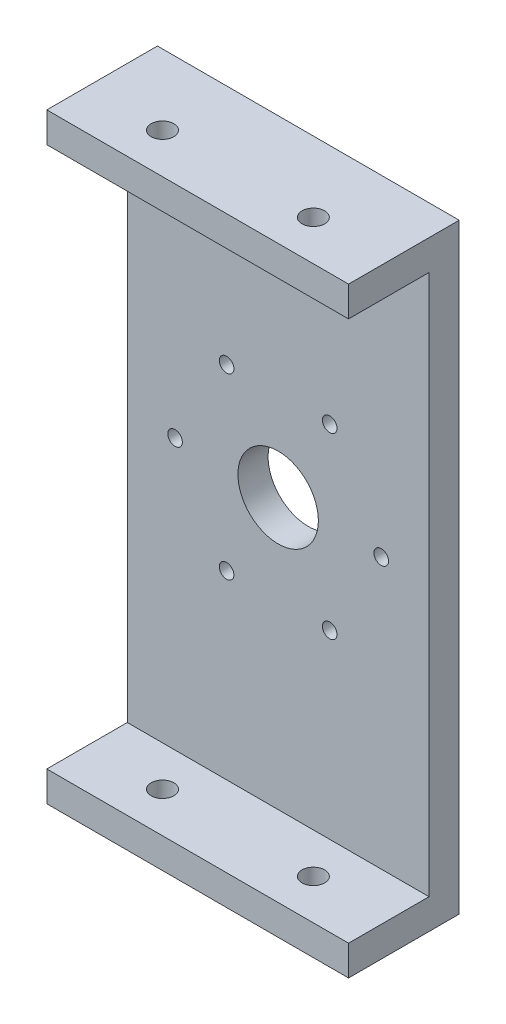
ISO-10303-21;
HEADER;
FILE_DESCRIPTION(('STEP AP214'),'2;1');
FILE_NAME('part.step','',(''),(''),'','','');
FILE_SCHEMA(('AUTOMOTIVE_DESIGN { 1 0 10303 214 1 1 1 1 }'));
ENDSEC;
DATA;
#1=APPLICATION_CONTEXT('core data for automotive mechanical design processes');
#2=APPLICATION_PROTOCOL_DEFINITION('international standard','automotive_design',2000,#1);
#3=PRODUCT_CONTEXT('',#1,'mechanical');
#4=PRODUCT('Part','Part','',(#3));
#5=PRODUCT_RELATED_PRODUCT_CATEGORY('part','',(#4));
#6=PRODUCT_DEFINITION_FORMATION('','',#4);
#7=PRODUCT_DEFINITION_CONTEXT('part definition',#1,'design');
#8=PRODUCT_DEFINITION('design','',#6,#7);
#9=PRODUCT_DEFINITION_SHAPE('','',#8);
#10=(LENGTH_UNIT() NAMED_UNIT(*) SI_UNIT(.MILLI.,.METRE.));
#11=(NAMED_UNIT(*) PLANE_ANGLE_UNIT() SI_UNIT($,.RADIAN.));
#12=(NAMED_UNIT(*) SI_UNIT($,.STERADIAN.) SOLID_ANGLE_UNIT());
#13=UNCERTAINTY_MEASURE_WITH_UNIT(LENGTH_MEASURE(1.E-05),#10,'distance_accuracy_value','');
#14=(GEOMETRIC_REPRESENTATION_CONTEXT(3) GLOBAL_UNCERTAINTY_ASSIGNED_CONTEXT((#13)) GLOBAL_UNIT_ASSIGNED_CONTEXT((#10,
#11,#12)) REPRESENTATION_CONTEXT('',''));
#15=CARTESIAN_POINT('',(0.,0.,0.));
#16=DIRECTION('',(0.,0.,1.));
#17=DIRECTION('',(1.,0.,0.));
#18=AXIS2_PLACEMENT_3D('',#15,#16,#17);
#19=CARTESIAN_POINT('',(0.,0.,379.));
#20=DIRECTION('',(0.,0.,-1.));
#21=DIRECTION('',(-1.,0.,0.));
#22=AXIS2_PLACEMENT_3D('',#19,#20,#21);
#23=PLANE('',#22);
#24=CARTESIAN_POINT('',(20.5,0.,379.));
#25=DIRECTION('',(0.,0.,1.));
#26=DIRECTION('',(1.,0.,0.));
#27=AXIS2_PLACEMENT_3D('',#24,#25,#26);
#28=CIRCLE('',#27,1.45);
#29=CARTESIAN_POINT('',(21.95,0.,379.));
#30=VERTEX_POINT('',#29);
#31=EDGE_CURVE('E180',#30,#30,#28,.T.);
#32=ORIENTED_EDGE('',*,*,#31,.F.);
#33=EDGE_LOOP('',(#32));
#34=FACE_BOUND('',#33,.T.);
#35=CARTESIAN_POINT('',(10.25,-17.753520777581,379.));
#36=DIRECTION('',(0.,0.,1.));
#37=DIRECTION('',(1.,0.,0.));
#38=AXIS2_PLACEMENT_3D('',#35,#36,#37);
#39=CIRCLE('',#38,1.45);
#40=CARTESIAN_POINT('',(11.7,-17.753520777581,379.));
#41=VERTEX_POINT('',#40);
#42=EDGE_CURVE('E155',#41,#41,#39,.T.);
#43=ORIENTED_EDGE('',*,*,#42,.F.);
#44=EDGE_LOOP('',(#43));
#45=FACE_BOUND('',#44,.T.);
#46=CARTESIAN_POINT('',(-10.25,-17.753520777581,379.));
#47=DIRECTION('',(0.,0.,1.));
#48=DIRECTION('',(1.,0.,0.));
#49=AXIS2_PLACEMENT_3D('',#46,#47,#48);
#50=CIRCLE('',#49,1.45);
#51=CARTESIAN_POINT('',(-8.80000000000001,-17.753520777581,379.));
#52=VERTEX_POINT('',#51);
#53=EDGE_CURVE('E192',#52,#52,#50,.T.);
#54=ORIENTED_EDGE('',*,*,#53,.F.);
#55=EDGE_LOOP('',(#54));
#56=FACE_BOUND('',#55,.T.);
#57=CARTESIAN_POINT('',(-20.5,0.,379.));
#58=DIRECTION('',(0.,0.,1.));
#59=DIRECTION('',(1.,0.,0.));
#60=AXIS2_PLACEMENT_3D('',#57,#58,#59);
#61=CIRCLE('',#60,1.45);
#62=CARTESIAN_POINT('',(-19.05,0.,379.));
#63=VERTEX_POINT('',#62);
#64=EDGE_CURVE('E212',#63,#63,#61,.T.);
#65=ORIENTED_EDGE('',*,*,#64,.F.);
#66=EDGE_LOOP('',(#65));
#67=FACE_BOUND('',#66,.T.);
#68=CARTESIAN_POINT('',(-10.25,17.753520777581,379.));
#69=DIRECTION('',(0.,0.,1.));
#70=DIRECTION('',(1.,0.,0.));
#71=AXIS2_PLACEMENT_3D('',#68,#69,#70);
#72=CIRCLE('',#71,1.45);
#73=CARTESIAN_POINT('',(-8.8,17.753520777581,379.));
#74=VERTEX_POINT('',#73);
#75=EDGE_CURVE('E206',#74,#74,#72,.T.);
#76=ORIENTED_EDGE('',*,*,#75,.F.);
#77=EDGE_LOOP('',(#76));
#78=FACE_BOUND('',#77,.T.);
#79=CARTESIAN_POINT('',(10.25,17.753520777581,379.));
#80=DIRECTION('',(0.,0.,1.));
#81=DIRECTION('',(1.,0.,0.));
#82=AXIS2_PLACEMENT_3D('',#79,#80,#81);
#83=CIRCLE('',#82,1.45);
#84=CARTESIAN_POINT('',(11.7,17.753520777581,379.));
#85=VERTEX_POINT('',#84);
#86=EDGE_CURVE('E196',#85,#85,#83,.T.);
#87=ORIENTED_EDGE('',*,*,#86,.F.);
#88=EDGE_LOOP('',(#87));
#89=FACE_BOUND('',#88,.T.);
#90=CARTESIAN_POINT('',(0.,0.,379.));
#91=DIRECTION('',(0.,0.,1.));
#92=DIRECTION('',(1.,0.,0.));
#93=AXIS2_PLACEMENT_3D('',#90,#91,#92);
#94=CIRCLE('',#93,8.);
#95=CARTESIAN_POINT('',(8.,0.,379.));
#96=VERTEX_POINT('',#95);
#97=EDGE_CURVE('E223',#96,#96,#94,.T.);
#98=ORIENTED_EDGE('',*,*,#97,.F.);
#99=EDGE_LOOP('',(#98));
#100=FACE_BOUND('',#99,.T.);
#101=DIRECTION('',(1.,0.,0.));
#102=VECTOR('',#101,1.);
#103=CARTESIAN_POINT('',(-30.,53.75,379.));
#104=LINE('',#103,#102);
#105=CARTESIAN_POINT('',(-30.,53.75,379.));
#106=VERTEX_POINT('',#105);
#107=CARTESIAN_POINT('',(30.,53.75,379.));
#108=VERTEX_POINT('',#107);
#109=EDGE_CURVE('E63',#106,#108,#104,.T.);
#110=ORIENTED_EDGE('',*,*,#109,.F.);
#111=DIRECTION('',(0.,-1.,0.));
#112=VECTOR('',#111,1.);
#113=CARTESIAN_POINT('',(-30.,-59.75,379.));
#114=LINE('',#113,#112);
#115=CARTESIAN_POINT('',(-30.,-53.75,379.));
#116=VERTEX_POINT('',#115);
#117=EDGE_CURVE('E233',#106,#116,#114,.T.);
#118=ORIENTED_EDGE('',*,*,#117,.T.);
#119=DIRECTION('',(-1.,0.,0.));
#120=VECTOR('',#119,1.);
#121=CARTESIAN_POINT('',(-30.,-53.75,379.));
#122=LINE('',#121,#120);
#123=CARTESIAN_POINT('',(30.,-53.75,379.));
#124=VERTEX_POINT('',#123);
#125=EDGE_CURVE('E67',#124,#116,#122,.T.);
#126=ORIENTED_EDGE('',*,*,#125,.F.);
#127=DIRECTION('',(0.,1.,0.));
#128=VECTOR('',#127,1.);
#129=CARTESIAN_POINT('',(30.,-59.75,379.));
#130=LINE('',#129,#128);
#131=EDGE_CURVE('E235',#124,#108,#130,.T.);
#132=ORIENTED_EDGE('',*,*,#131,.T.);
#133=EDGE_LOOP('',(#110,#118,#126,#132));
#134=FACE_BOUND('',#133,.T.);
#135=ADVANCED_FACE('F43',(#34,#45,#56,#67,#78,#89,#100,#134),#23,.F.);
#136=CARTESIAN_POINT('',(30.,-59.75,379.));
#137=DIRECTION('',(-1.,0.,0.));
#138=DIRECTION('',(0.,0.,1.));
#139=AXIS2_PLACEMENT_3D('',#136,#137,#138);
#140=PLANE('',#139);
#141=DIRECTION('',(0.,1.,0.));
#142=VECTOR('',#141,1.);
#143=CARTESIAN_POINT('',(30.,-59.75,373.));
#144=LINE('',#143,#142);
#145=CARTESIAN_POINT('',(30.,-59.75,373.));
#146=VERTEX_POINT('',#145);
#147=CARTESIAN_POINT('',(30.,59.75,373.));
#148=VERTEX_POINT('',#147);
#149=EDGE_CURVE('E118',#146,#148,#144,.T.);
#150=ORIENTED_EDGE('',*,*,#149,.T.);
#151=DIRECTION('',(0.,0.,-1.));
#152=VECTOR('',#151,1.);
#153=CARTESIAN_POINT('',(30.,59.75,379.));
#154=LINE('',#153,#152);
#155=CARTESIAN_POINT('',(30.,59.75,395.));
#156=VERTEX_POINT('',#155);
#157=EDGE_CURVE('E11',#156,#148,#154,.T.);
#158=ORIENTED_EDGE('',*,*,#157,.F.);
#159=DIRECTION('',(0.,1.,0.));
#160=VECTOR('',#159,1.);
#161=CARTESIAN_POINT('',(30.,53.75,395.));
#162=LINE('',#161,#160);
#163=CARTESIAN_POINT('',(30.,53.75,395.));
#164=VERTEX_POINT('',#163);
#165=EDGE_CURVE('E114',#164,#156,#162,.T.);
#166=ORIENTED_EDGE('',*,*,#165,.F.);
#167=DIRECTION('',(0.,0.,-1.));
#168=VECTOR('',#167,1.);
#169=CARTESIAN_POINT('',(30.,53.75,395.));
#170=LINE('',#169,#168);
#171=EDGE_CURVE('E145',#164,#108,#170,.T.);
#172=ORIENTED_EDGE('',*,*,#171,.T.);
#173=ORIENTED_EDGE('',*,*,#131,.F.);
#174=DIRECTION('',(0.,0.,-1.));
#175=VECTOR('',#174,1.);
#176=CARTESIAN_POINT('',(30.,-53.75,395.));
#177=LINE('',#176,#175);
#178=CARTESIAN_POINT('',(30.,-53.75,395.));
#179=VERTEX_POINT('',#178);
#180=EDGE_CURVE('E153',#179,#124,#177,.T.);
#181=ORIENTED_EDGE('',*,*,#180,.F.);
#182=DIRECTION('',(0.,1.,0.));
#183=VECTOR('',#182,1.);
#184=CARTESIAN_POINT('',(30.,-59.75,395.));
#185=LINE('',#184,#183);
#186=CARTESIAN_POINT('',(30.,-59.75,395.));
#187=VERTEX_POINT('',#186);
#188=EDGE_CURVE('E163',#187,#179,#185,.T.);
#189=ORIENTED_EDGE('',*,*,#188,.F.);
#190=DIRECTION('',(0.,0.,-1.));
#191=VECTOR('',#190,1.);
#192=CARTESIAN_POINT('',(30.,-59.75,379.));
#193=LINE('',#192,#191);
#194=EDGE_CURVE('E239',#187,#146,#193,.T.);
#195=ORIENTED_EDGE('',*,*,#194,.T.);
#196=EDGE_LOOP('',(#150,#158,#166,#172,#173,#181,#189,#195));
#197=FACE_BOUND('',#196,.T.);
#198=ADVANCED_FACE('F44',(#197),#140,.F.);
#199=CARTESIAN_POINT('',(-30.,59.75,379.));
#200=DIRECTION('',(0.,-1.,0.));
#201=DIRECTION('',(0.,0.,-1.));
#202=AXIS2_PLACEMENT_3D('',#199,#200,#201);
#203=PLANE('',#202);
#204=CARTESIAN_POINT('',(-15.,59.75,387.));
#205=DIRECTION('',(0.,1.,0.));
#206=DIRECTION('',(0.,0.,1.));
#207=AXIS2_PLACEMENT_3D('',#204,#205,#206);
#208=CIRCLE('',#207,2.25);
#209=CARTESIAN_POINT('',(-15.,59.75,389.25));
#210=VERTEX_POINT('',#209);
#211=EDGE_CURVE('E261',#210,#210,#208,.T.);
#212=ORIENTED_EDGE('',*,*,#211,.F.);
#213=EDGE_LOOP('',(#212));
#214=FACE_BOUND('',#213,.T.);
#215=CARTESIAN_POINT('',(15.,59.75,387.));
#216=DIRECTION('',(0.,1.,0.));
#217=DIRECTION('',(0.,0.,1.));
#218=AXIS2_PLACEMENT_3D('',#215,#216,#217);
#219=CIRCLE('',#218,2.25);
#220=CARTESIAN_POINT('',(15.,59.75,389.25));
#221=VERTEX_POINT('',#220);
#222=EDGE_CURVE('E278',#221,#221,#219,.T.);
#223=ORIENTED_EDGE('',*,*,#222,.F.);
#224=EDGE_LOOP('',(#223));
#225=FACE_BOUND('',#224,.T.);
#226=DIRECTION('',(-1.,0.,0.));
#227=VECTOR('',#226,1.);
#228=CARTESIAN_POINT('',(-30.,59.75,373.));
#229=LINE('',#228,#227);
#230=CARTESIAN_POINT('',(-30.,59.75,373.));
#231=VERTEX_POINT('',#230);
#232=EDGE_CURVE('E245',#148,#231,#229,.T.);
#233=ORIENTED_EDGE('',*,*,#232,.T.);
#234=DIRECTION('',(0.,0.,-1.));
#235=VECTOR('',#234,1.);
#236=CARTESIAN_POINT('',(-30.,59.75,379.));
#237=LINE('',#236,#235);
#238=CARTESIAN_POINT('',(-30.,59.75,395.));
#239=VERTEX_POINT('',#238);
#240=EDGE_CURVE('E52',#239,#231,#237,.T.);
#241=ORIENTED_EDGE('',*,*,#240,.F.);
#242=DIRECTION('',(-1.,0.,0.));
#243=VECTOR('',#242,1.);
#244=CARTESIAN_POINT('',(-30.,59.75,395.));
#245=LINE('',#244,#243);
#246=EDGE_CURVE('E117',#156,#239,#245,.T.);
#247=ORIENTED_EDGE('',*,*,#246,.F.);
#248=ORIENTED_EDGE('',*,*,#157,.T.);
#249=EDGE_LOOP('',(#233,#241,#247,#248));
#250=FACE_BOUND('',#249,.T.);
#251=ADVANCED_FACE('F119',(#214,#225,#250),#203,.F.);
#252=CARTESIAN_POINT('',(-30.,-59.75,379.));
#253=DIRECTION('',(1.,0.,0.));
#254=DIRECTION('',(0.,0.,-1.));
#255=AXIS2_PLACEMENT_3D('',#252,#253,#254);
#256=PLANE('',#255);
#257=DIRECTION('',(0.,-1.,0.));
#258=VECTOR('',#257,1.);
#259=CARTESIAN_POINT('',(-30.,-59.75,373.));
#260=LINE('',#259,#258);
#261=CARTESIAN_POINT('',(-30.,-59.75,373.));
#262=VERTEX_POINT('',#261);
#263=EDGE_CURVE('E244',#231,#262,#260,.T.);
#264=ORIENTED_EDGE('',*,*,#263,.T.);
#265=DIRECTION('',(0.,0.,-1.));
#266=VECTOR('',#265,1.);
#267=CARTESIAN_POINT('',(-30.,-59.75,379.));
#268=LINE('',#267,#266);
#269=CARTESIAN_POINT('',(-30.,-59.75,395.));
#270=VERTEX_POINT('',#269);
#271=EDGE_CURVE('E252',#270,#262,#268,.T.);
#272=ORIENTED_EDGE('',*,*,#271,.F.);
#273=DIRECTION('',(0.,-1.,0.));
#274=VECTOR('',#273,1.);
#275=CARTESIAN_POINT('',(-30.,-59.75,395.));
#276=LINE('',#275,#274);
#277=CARTESIAN_POINT('',(-30.,-53.75,395.));
#278=VERTEX_POINT('',#277);
#279=EDGE_CURVE('E170',#278,#270,#276,.T.);
#280=ORIENTED_EDGE('',*,*,#279,.F.);
#281=DIRECTION('',(0.,0.,-1.));
#282=VECTOR('',#281,1.);
#283=CARTESIAN_POINT('',(-30.,-53.75,395.));
#284=LINE('',#283,#282);
#285=EDGE_CURVE('E160',#278,#116,#284,.T.);
#286=ORIENTED_EDGE('',*,*,#285,.T.);
#287=ORIENTED_EDGE('',*,*,#117,.F.);
#288=DIRECTION('',(0.,0.,-1.));
#289=VECTOR('',#288,1.);
#290=CARTESIAN_POINT('',(-30.,53.75,395.));
#291=LINE('',#290,#289);
#292=CARTESIAN_POINT('',(-30.,53.75,395.));
#293=VERTEX_POINT('',#292);
#294=EDGE_CURVE('E146',#293,#106,#291,.T.);
#295=ORIENTED_EDGE('',*,*,#294,.F.);
#296=DIRECTION('',(0.,-1.,0.));
#297=VECTOR('',#296,1.);
#298=CARTESIAN_POINT('',(-30.,53.75,395.));
#299=LINE('',#298,#297);
#300=EDGE_CURVE('E123',#239,#293,#299,.T.);
#301=ORIENTED_EDGE('',*,*,#300,.F.);
#302=ORIENTED_EDGE('',*,*,#240,.T.);
#303=EDGE_LOOP('',(#264,#272,#280,#286,#287,#295,#301,#302));
#304=FACE_BOUND('',#303,.T.);
#305=ADVANCED_FACE('F289',(#304),#256,.F.);
#306=CARTESIAN_POINT('',(-30.,-59.75,379.));
#307=DIRECTION('',(0.,1.,0.));
#308=DIRECTION('',(0.,0.,1.));
#309=AXIS2_PLACEMENT_3D('',#306,#307,#308);
#310=PLANE('',#309);
#311=CARTESIAN_POINT('',(-15.,-59.75,387.));
#312=DIRECTION('',(0.,1.,0.));
#313=DIRECTION('',(0.,0.,1.));
#314=AXIS2_PLACEMENT_3D('',#311,#312,#313);
#315=CIRCLE('',#314,2.25);
#316=CARTESIAN_POINT('',(-15.,-59.75,389.25));
#317=VERTEX_POINT('',#316);
#318=EDGE_CURVE('E268',#317,#317,#315,.T.);
#319=ORIENTED_EDGE('',*,*,#318,.T.);
#320=EDGE_LOOP('',(#319));
#321=FACE_BOUND('',#320,.T.);
#322=CARTESIAN_POINT('',(15.,-59.75,387.));
#323=DIRECTION('',(0.,1.,0.));
#324=DIRECTION('',(0.,0.,1.));
#325=AXIS2_PLACEMENT_3D('',#322,#323,#324);
#326=CIRCLE('',#325,2.25);
#327=CARTESIAN_POINT('',(15.,-59.75,389.25));
#328=VERTEX_POINT('',#327);
#329=EDGE_CURVE('E273',#328,#328,#326,.T.);
#330=ORIENTED_EDGE('',*,*,#329,.T.);
#331=EDGE_LOOP('',(#330));
#332=FACE_BOUND('',#331,.T.);
#333=DIRECTION('',(1.,0.,0.));
#334=VECTOR('',#333,1.);
#335=CARTESIAN_POINT('',(-30.,-59.75,373.));
#336=LINE('',#335,#334);
#337=EDGE_CURVE('E237',#262,#146,#336,.T.);
#338=ORIENTED_EDGE('',*,*,#337,.T.);
#339=ORIENTED_EDGE('',*,*,#194,.F.);
#340=DIRECTION('',(1.,0.,0.));
#341=VECTOR('',#340,1.);
#342=CARTESIAN_POINT('',(-30.,-59.75,395.));
#343=LINE('',#342,#341);
#344=EDGE_CURVE('E161',#270,#187,#343,.T.);
#345=ORIENTED_EDGE('',*,*,#344,.F.);
#346=ORIENTED_EDGE('',*,*,#271,.T.);
#347=EDGE_LOOP('',(#338,#339,#345,#346));
#348=FACE_BOUND('',#347,.T.);
#349=ADVANCED_FACE('F291',(#321,#332,#348),#310,.F.);
#350=CARTESIAN_POINT('',(0.,0.,373.));
#351=DIRECTION('',(0.,0.,-1.));
#352=DIRECTION('',(-1.,0.,0.));
#353=AXIS2_PLACEMENT_3D('',#350,#351,#352);
#354=PLANE('',#353);
#355=CARTESIAN_POINT('',(20.5,0.,373.));
#356=DIRECTION('',(0.,0.,1.));
#357=DIRECTION('',(1.,0.,0.));
#358=AXIS2_PLACEMENT_3D('',#355,#356,#357);
#359=CIRCLE('',#358,1.45);
#360=CARTESIAN_POINT('',(21.95,0.,373.));
#361=VERTEX_POINT('',#360);
#362=EDGE_CURVE('E185',#361,#361,#359,.T.);
#363=ORIENTED_EDGE('',*,*,#362,.T.);
#364=EDGE_LOOP('',(#363));
#365=FACE_BOUND('',#364,.T.);
#366=CARTESIAN_POINT('',(10.25,-17.753520777581,373.));
#367=DIRECTION('',(0.,0.,1.));
#368=DIRECTION('',(1.,0.,0.));
#369=AXIS2_PLACEMENT_3D('',#366,#367,#368);
#370=CIRCLE('',#369,1.45);
#371=CARTESIAN_POINT('',(11.7,-17.753520777581,373.));
#372=VERTEX_POINT('',#371);
#373=EDGE_CURVE('E190',#372,#372,#370,.T.);
#374=ORIENTED_EDGE('',*,*,#373,.T.);
#375=EDGE_LOOP('',(#374));
#376=FACE_BOUND('',#375,.T.);
#377=CARTESIAN_POINT('',(-10.25,-17.753520777581,373.));
#378=DIRECTION('',(0.,0.,1.));
#379=DIRECTION('',(1.,0.,0.));
#380=AXIS2_PLACEMENT_3D('',#377,#378,#379);
#381=CIRCLE('',#380,1.45);
#382=CARTESIAN_POINT('',(-8.80000000000001,-17.753520777581,373.));
#383=VERTEX_POINT('',#382);
#384=EDGE_CURVE('E217',#383,#383,#381,.T.);
#385=ORIENTED_EDGE('',*,*,#384,.T.);
#386=EDGE_LOOP('',(#385));
#387=FACE_BOUND('',#386,.T.);
#388=CARTESIAN_POINT('',(-20.5,0.,373.));
#389=DIRECTION('',(0.,0.,1.));
#390=DIRECTION('',(1.,0.,0.));
#391=AXIS2_PLACEMENT_3D('',#388,#389,#390);
#392=CIRCLE('',#391,1.45);
#393=CARTESIAN_POINT('',(-19.05,0.,373.));
#394=VERTEX_POINT('',#393);
#395=EDGE_CURVE('E209',#394,#394,#392,.T.);
#396=ORIENTED_EDGE('',*,*,#395,.T.);
#397=EDGE_LOOP('',(#396));
#398=FACE_BOUND('',#397,.T.);
#399=CARTESIAN_POINT('',(-10.25,17.753520777581,373.));
#400=DIRECTION('',(0.,0.,1.));
#401=DIRECTION('',(1.,0.,0.));
#402=AXIS2_PLACEMENT_3D('',#399,#400,#401);
#403=CIRCLE('',#402,1.45);
#404=CARTESIAN_POINT('',(-8.8,17.753520777581,373.));
#405=VERTEX_POINT('',#404);
#406=EDGE_CURVE('E205',#405,#405,#403,.T.);
#407=ORIENTED_EDGE('',*,*,#406,.T.);
#408=EDGE_LOOP('',(#407));
#409=FACE_BOUND('',#408,.T.);
#410=CARTESIAN_POINT('',(10.25,17.753520777581,373.));
#411=DIRECTION('',(0.,0.,1.));
#412=DIRECTION('',(1.,0.,0.));
#413=AXIS2_PLACEMENT_3D('',#410,#411,#412);
#414=CIRCLE('',#413,1.45);
#415=CARTESIAN_POINT('',(11.7,17.753520777581,373.));
#416=VERTEX_POINT('',#415);
#417=EDGE_CURVE('E188',#416,#416,#414,.T.);
#418=ORIENTED_EDGE('',*,*,#417,.T.);
#419=EDGE_LOOP('',(#418));
#420=FACE_BOUND('',#419,.T.);
#421=CARTESIAN_POINT('',(0.,0.,373.));
#422=DIRECTION('',(0.,0.,1.));
#423=DIRECTION('',(1.,0.,0.));
#424=AXIS2_PLACEMENT_3D('',#421,#422,#423);
#425=CIRCLE('',#424,8.);
#426=CARTESIAN_POINT('',(8.,0.,373.));
#427=VERTEX_POINT('',#426);
#428=EDGE_CURVE('E182',#427,#427,#425,.T.);
#429=ORIENTED_EDGE('',*,*,#428,.T.);
#430=EDGE_LOOP('',(#429));
#431=FACE_BOUND('',#430,.T.);
#432=ORIENTED_EDGE('',*,*,#149,.F.);
#433=ORIENTED_EDGE('',*,*,#337,.F.);
#434=ORIENTED_EDGE('',*,*,#263,.F.);
#435=ORIENTED_EDGE('',*,*,#232,.F.);
#436=EDGE_LOOP('',(#432,#433,#434,#435));
#437=FACE_BOUND('',#436,.T.);
#438=ADVANCED_FACE('F308',(#365,#376,#387,#398,#409,#420,#431,#437),#354,.T.);
#439=CARTESIAN_POINT('',(0.,0.,379.));
#440=DIRECTION('',(0.,0.,-1.));
#441=DIRECTION('',(-1.,0.,0.));
#442=AXIS2_PLACEMENT_3D('',#439,#440,#441);
#443=CYLINDRICAL_SURFACE('',#442,8.);
#444=ORIENTED_EDGE('',*,*,#97,.T.);
#445=EDGE_LOOP('',(#444));
#446=FACE_BOUND('',#445,.T.);
#447=ORIENTED_EDGE('',*,*,#428,.F.);
#448=EDGE_LOOP('',(#447));
#449=FACE_BOUND('',#448,.T.);
#450=ADVANCED_FACE('F301',(#446,#449),#443,.F.);
#451=CARTESIAN_POINT('',(10.25,17.753520777581,379.));
#452=DIRECTION('',(0.,0.,-1.));
#453=DIRECTION('',(-1.,0.,0.));
#454=AXIS2_PLACEMENT_3D('',#451,#452,#453);
#455=CYLINDRICAL_SURFACE('',#454,1.45);
#456=ORIENTED_EDGE('',*,*,#86,.T.);
#457=EDGE_LOOP('',(#456));
#458=FACE_BOUND('',#457,.T.);
#459=ORIENTED_EDGE('',*,*,#417,.F.);
#460=EDGE_LOOP('',(#459));
#461=FACE_BOUND('',#460,.T.);
#462=ADVANCED_FACE('F353',(#458,#461),#455,.F.);
#463=CARTESIAN_POINT('',(-10.25,17.753520777581,379.));
#464=DIRECTION('',(0.,0.,-1.));
#465=DIRECTION('',(-1.,0.,0.));
#466=AXIS2_PLACEMENT_3D('',#463,#464,#465);
#467=CYLINDRICAL_SURFACE('',#466,1.45);
#468=ORIENTED_EDGE('',*,*,#75,.T.);
#469=EDGE_LOOP('',(#468));
#470=FACE_BOUND('',#469,.T.);
#471=ORIENTED_EDGE('',*,*,#406,.F.);
#472=EDGE_LOOP('',(#471));
#473=FACE_BOUND('',#472,.T.);
#474=ADVANCED_FACE('F352',(#470,#473),#467,.F.);
#475=CARTESIAN_POINT('',(-20.5,0.,379.));
#476=DIRECTION('',(0.,0.,-1.));
#477=DIRECTION('',(-1.,0.,0.));
#478=AXIS2_PLACEMENT_3D('',#475,#476,#477);
#479=CYLINDRICAL_SURFACE('',#478,1.45);
#480=ORIENTED_EDGE('',*,*,#64,.T.);
#481=EDGE_LOOP('',(#480));
#482=FACE_BOUND('',#481,.T.);
#483=ORIENTED_EDGE('',*,*,#395,.F.);
#484=EDGE_LOOP('',(#483));
#485=FACE_BOUND('',#484,.T.);
#486=ADVANCED_FACE('F359',(#482,#485),#479,.F.);
#487=CARTESIAN_POINT('',(-10.25,-17.753520777581,379.));
#488=DIRECTION('',(0.,0.,-1.));
#489=DIRECTION('',(-1.,0.,0.));
#490=AXIS2_PLACEMENT_3D('',#487,#488,#489);
#491=CYLINDRICAL_SURFACE('',#490,1.45);
#492=ORIENTED_EDGE('',*,*,#53,.T.);
#493=EDGE_LOOP('',(#492));
#494=FACE_BOUND('',#493,.T.);
#495=ORIENTED_EDGE('',*,*,#384,.F.);
#496=EDGE_LOOP('',(#495));
#497=FACE_BOUND('',#496,.T.);
#498=ADVANCED_FACE('F349',(#494,#497),#491,.F.);
#499=CARTESIAN_POINT('',(10.25,-17.753520777581,379.));
#500=DIRECTION('',(0.,0.,-1.));
#501=DIRECTION('',(-1.,0.,0.));
#502=AXIS2_PLACEMENT_3D('',#499,#500,#501);
#503=CYLINDRICAL_SURFACE('',#502,1.45);
#504=ORIENTED_EDGE('',*,*,#42,.T.);
#505=EDGE_LOOP('',(#504));
#506=FACE_BOUND('',#505,.T.);
#507=ORIENTED_EDGE('',*,*,#373,.F.);
#508=EDGE_LOOP('',(#507));
#509=FACE_BOUND('',#508,.T.);
#510=ADVANCED_FACE('F343',(#506,#509),#503,.F.);
#511=CARTESIAN_POINT('',(20.5,0.,379.));
#512=DIRECTION('',(0.,0.,-1.));
#513=DIRECTION('',(-1.,0.,0.));
#514=AXIS2_PLACEMENT_3D('',#511,#512,#513);
#515=CYLINDRICAL_SURFACE('',#514,1.45);
#516=ORIENTED_EDGE('',*,*,#31,.T.);
#517=EDGE_LOOP('',(#516));
#518=FACE_BOUND('',#517,.T.);
#519=ORIENTED_EDGE('',*,*,#362,.F.);
#520=EDGE_LOOP('',(#519));
#521=FACE_BOUND('',#520,.T.);
#522=ADVANCED_FACE('F337',(#518,#521),#515,.F.);
#523=CARTESIAN_POINT('',(-30.,-53.75,395.));
#524=DIRECTION('',(0.,-1.,0.));
#525=DIRECTION('',(0.,0.,-1.));
#526=AXIS2_PLACEMENT_3D('',#523,#524,#525);
#527=PLANE('',#526);
#528=CARTESIAN_POINT('',(-15.,-53.75,387.));
#529=DIRECTION('',(0.,-1.,0.));
#530=DIRECTION('',(0.,0.,-1.));
#531=AXIS2_PLACEMENT_3D('',#528,#529,#530);
#532=CIRCLE('',#531,2.25);
#533=CARTESIAN_POINT('',(-15.,-53.75,384.75));
#534=VERTEX_POINT('',#533);
#535=EDGE_CURVE('E139',#534,#534,#532,.F.);
#536=ORIENTED_EDGE('',*,*,#535,.F.);
#537=EDGE_LOOP('',(#536));
#538=FACE_BOUND('',#537,.T.);
#539=CARTESIAN_POINT('',(15.,-53.75,387.));
#540=DIRECTION('',(0.,-1.,0.));
#541=DIRECTION('',(0.,0.,-1.));
#542=AXIS2_PLACEMENT_3D('',#539,#540,#541);
#543=CIRCLE('',#542,2.25);
#544=CARTESIAN_POINT('',(15.,-53.75,384.75));
#545=VERTEX_POINT('',#544);
#546=EDGE_CURVE('E257',#545,#545,#543,.F.);
#547=ORIENTED_EDGE('',*,*,#546,.F.);
#548=EDGE_LOOP('',(#547));
#549=FACE_BOUND('',#548,.T.);
#550=ORIENTED_EDGE('',*,*,#125,.T.);
#551=ORIENTED_EDGE('',*,*,#285,.F.);
#552=DIRECTION('',(-1.,0.,0.));
#553=VECTOR('',#552,1.);
#554=CARTESIAN_POINT('',(-30.,-53.75,395.));
#555=LINE('',#554,#553);
#556=EDGE_CURVE('E173',#179,#278,#555,.T.);
#557=ORIENTED_EDGE('',*,*,#556,.F.);
#558=ORIENTED_EDGE('',*,*,#180,.T.);
#559=EDGE_LOOP('',(#550,#551,#557,#558));
#560=FACE_BOUND('',#559,.T.);
#561=ADVANCED_FACE('F330',(#538,#549,#560),#527,.F.);
#562=CARTESIAN_POINT('',(0.,0.,395.));
#563=DIRECTION('',(0.,0.,-1.));
#564=DIRECTION('',(-1.,0.,0.));
#565=AXIS2_PLACEMENT_3D('',#562,#563,#564);
#566=PLANE('',#565);
#567=ORIENTED_EDGE('',*,*,#188,.T.);
#568=ORIENTED_EDGE('',*,*,#556,.T.);
#569=ORIENTED_EDGE('',*,*,#279,.T.);
#570=ORIENTED_EDGE('',*,*,#344,.T.);
#571=EDGE_LOOP('',(#567,#568,#569,#570));
#572=FACE_BOUND('',#571,.T.);
#573=ADVANCED_FACE('F332',(#572),#566,.F.);
#574=CARTESIAN_POINT('',(-30.,53.75,395.));
#575=DIRECTION('',(0.,1.,0.));
#576=DIRECTION('',(0.,0.,1.));
#577=AXIS2_PLACEMENT_3D('',#574,#575,#576);
#578=PLANE('',#577);
#579=CARTESIAN_POINT('',(-15.,53.75,387.));
#580=DIRECTION('',(0.,1.,0.));
#581=DIRECTION('',(0.,0.,1.));
#582=AXIS2_PLACEMENT_3D('',#579,#580,#581);
#583=CIRCLE('',#582,2.25);
#584=CARTESIAN_POINT('',(-15.,53.75,389.25));
#585=VERTEX_POINT('',#584);
#586=EDGE_CURVE('E50',#585,#585,#583,.F.);
#587=ORIENTED_EDGE('',*,*,#586,.F.);
#588=EDGE_LOOP('',(#587));
#589=FACE_BOUND('',#588,.T.);
#590=CARTESIAN_POINT('',(15.,53.75,387.));
#591=DIRECTION('',(0.,1.,0.));
#592=DIRECTION('',(0.,0.,1.));
#593=AXIS2_PLACEMENT_3D('',#590,#591,#592);
#594=CIRCLE('',#593,2.25);
#595=CARTESIAN_POINT('',(15.,53.75,389.25));
#596=VERTEX_POINT('',#595);
#597=EDGE_CURVE('E260',#596,#596,#594,.F.);
#598=ORIENTED_EDGE('',*,*,#597,.F.);
#599=EDGE_LOOP('',(#598));
#600=FACE_BOUND('',#599,.T.);
#601=ORIENTED_EDGE('',*,*,#109,.T.);
#602=ORIENTED_EDGE('',*,*,#171,.F.);
#603=DIRECTION('',(1.,0.,0.));
#604=VECTOR('',#603,1.);
#605=CARTESIAN_POINT('',(-30.,53.75,395.));
#606=LINE('',#605,#604);
#607=EDGE_CURVE('E129',#293,#164,#606,.T.);
#608=ORIENTED_EDGE('',*,*,#607,.F.);
#609=ORIENTED_EDGE('',*,*,#294,.T.);
#610=EDGE_LOOP('',(#601,#602,#608,#609));
#611=FACE_BOUND('',#610,.T.);
#612=ADVANCED_FACE('F324',(#589,#600,#611),#578,.F.);
#613=CARTESIAN_POINT('',(0.,0.,395.));
#614=DIRECTION('',(0.,0.,-1.));
#615=DIRECTION('',(-1.,0.,0.));
#616=AXIS2_PLACEMENT_3D('',#613,#614,#615);
#617=PLANE('',#616);
#618=ORIENTED_EDGE('',*,*,#165,.T.);
#619=ORIENTED_EDGE('',*,*,#246,.T.);
#620=ORIENTED_EDGE('',*,*,#300,.T.);
#621=ORIENTED_EDGE('',*,*,#607,.T.);
#622=EDGE_LOOP('',(#618,#619,#620,#621));
#623=FACE_BOUND('',#622,.T.);
#624=ADVANCED_FACE('F130',(#623),#617,.F.);
#625=CARTESIAN_POINT('',(15.,59.75,387.));
#626=DIRECTION('',(0.,-1.,0.));
#627=DIRECTION('',(0.,0.,-1.));
#628=AXIS2_PLACEMENT_3D('',#625,#626,#627);
#629=CYLINDRICAL_SURFACE('',#628,2.25);
#630=ORIENTED_EDGE('',*,*,#222,.T.);
#631=EDGE_LOOP('',(#630));
#632=FACE_BOUND('',#631,.T.);
#633=ORIENTED_EDGE('',*,*,#597,.T.);
#634=EDGE_LOOP('',(#633));
#635=FACE_BOUND('',#634,.T.);
#636=ADVANCED_FACE('F284',(#632,#635),#629,.F.);
#637=CARTESIAN_POINT('',(-15.,59.75,387.));
#638=DIRECTION('',(0.,-1.,0.));
#639=DIRECTION('',(0.,0.,-1.));
#640=AXIS2_PLACEMENT_3D('',#637,#638,#639);
#641=CYLINDRICAL_SURFACE('',#640,2.25);
#642=ORIENTED_EDGE('',*,*,#211,.T.);
#643=EDGE_LOOP('',(#642));
#644=FACE_BOUND('',#643,.T.);
#645=ORIENTED_EDGE('',*,*,#586,.T.);
#646=EDGE_LOOP('',(#645));
#647=FACE_BOUND('',#646,.T.);
#648=ADVANCED_FACE('F472',(#644,#647),#641,.F.);
#649=ORIENTED_EDGE('',*,*,#329,.F.);
#650=EDGE_LOOP('',(#649));
#651=FACE_BOUND('',#650,.T.);
#652=ORIENTED_EDGE('',*,*,#546,.T.);
#653=EDGE_LOOP('',(#652));
#654=FACE_BOUND('',#653,.T.);
#655=ADVANCED_FACE('F475',(#651,#654),#629,.F.);
#656=ORIENTED_EDGE('',*,*,#318,.F.);
#657=EDGE_LOOP('',(#656));
#658=FACE_BOUND('',#657,.T.);
#659=ORIENTED_EDGE('',*,*,#535,.T.);
#660=EDGE_LOOP('',(#659));
#661=FACE_BOUND('',#660,.T.);
#662=ADVANCED_FACE('F483',(#658,#661),#641,.F.);
#663=CLOSED_SHELL('',(#135,#198,#251,#305,#349,#438,#450,#462,#474,#486,#498,#510,#522,#561,
#573,#612,#624,#636,#648,#655,#662));
#664=MANIFOLD_SOLID_BREP('B2',#663);
#665=ADVANCED_BREP_SHAPE_REPRESENTATION('',(#18,#664),#14);
#666=SHAPE_DEFINITION_REPRESENTATION(#9,#665);
ENDSEC;
END-ISO-10303-21;
